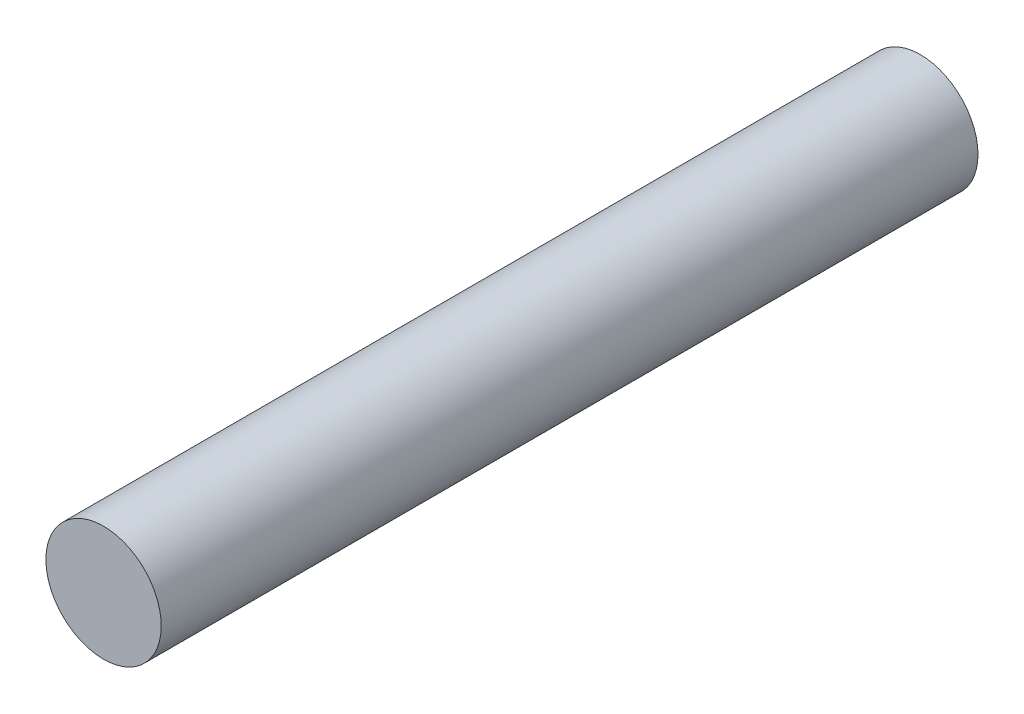
ISO-10303-21;
HEADER;
FILE_DESCRIPTION(('STEP AP214'),'2;1');
FILE_NAME('part.step','',(''),(''),'','','');
FILE_SCHEMA(('AUTOMOTIVE_DESIGN { 1 0 10303 214 1 1 1 1 }'));
ENDSEC;
DATA;
#1=APPLICATION_CONTEXT('core data for automotive mechanical design processes');
#2=APPLICATION_PROTOCOL_DEFINITION('international standard','automotive_design',2000,#1);
#3=PRODUCT_CONTEXT('',#1,'mechanical');
#4=PRODUCT('Part','Part','',(#3));
#5=PRODUCT_RELATED_PRODUCT_CATEGORY('part','',(#4));
#6=PRODUCT_DEFINITION_FORMATION('','',#4);
#7=PRODUCT_DEFINITION_CONTEXT('part definition',#1,'design');
#8=PRODUCT_DEFINITION('design','',#6,#7);
#9=PRODUCT_DEFINITION_SHAPE('','',#8);
#10=(LENGTH_UNIT() NAMED_UNIT(*) SI_UNIT(.MILLI.,.METRE.));
#11=(NAMED_UNIT(*) PLANE_ANGLE_UNIT() SI_UNIT($,.RADIAN.));
#12=(NAMED_UNIT(*) SI_UNIT($,.STERADIAN.) SOLID_ANGLE_UNIT());
#13=UNCERTAINTY_MEASURE_WITH_UNIT(LENGTH_MEASURE(1.E-05),#10,'distance_accuracy_value','');
#14=(GEOMETRIC_REPRESENTATION_CONTEXT(3) GLOBAL_UNCERTAINTY_ASSIGNED_CONTEXT((#13)) GLOBAL_UNIT_ASSIGNED_CONTEXT((#10,
#11,#12)) REPRESENTATION_CONTEXT('',''));
#15=CARTESIAN_POINT('',(0.,0.,0.));
#16=DIRECTION('',(0.,0.,1.));
#17=DIRECTION('',(1.,0.,0.));
#18=AXIS2_PLACEMENT_3D('',#15,#16,#17);
#19=CARTESIAN_POINT('',(0.,0.,85.));
#20=DIRECTION('',(0.,0.,-1.));
#21=DIRECTION('',(-1.,0.,0.));
#22=AXIS2_PLACEMENT_3D('',#19,#20,#21);
#23=CYLINDRICAL_SURFACE('',#22,6.);
#24=CARTESIAN_POINT('',(0.,0.,85.));
#25=DIRECTION('',(0.,0.,1.));
#26=DIRECTION('',(1.,0.,0.));
#27=AXIS2_PLACEMENT_3D('',#24,#25,#26);
#28=CIRCLE('',#27,6.);
#29=CARTESIAN_POINT('',(6.,0.,85.));
#30=VERTEX_POINT('',#29);
#31=EDGE_CURVE('E10',#30,#30,#28,.T.);
#32=ORIENTED_EDGE('',*,*,#31,.F.);
#33=EDGE_LOOP('',(#32));
#34=FACE_BOUND('',#33,.T.);
#35=CARTESIAN_POINT('',(0.,0.,0.));
#36=DIRECTION('',(0.,0.,1.));
#37=DIRECTION('',(1.,0.,0.));
#38=AXIS2_PLACEMENT_3D('',#35,#36,#37);
#39=CIRCLE('',#38,6.);
#40=CARTESIAN_POINT('',(6.,0.,0.));
#41=VERTEX_POINT('',#40);
#42=EDGE_CURVE('E34',#41,#41,#39,.T.);
#43=ORIENTED_EDGE('',*,*,#42,.T.);
#44=EDGE_LOOP('',(#43));
#45=FACE_BOUND('',#44,.T.);
#46=ADVANCED_FACE('F31',(#34,#45),#23,.T.);
#47=CARTESIAN_POINT('',(0.,0.,85.));
#48=DIRECTION('',(0.,0.,1.));
#49=DIRECTION('',(1.,0.,0.));
#50=AXIS2_PLACEMENT_3D('',#47,#48,#49);
#51=PLANE('',#50);
#52=ORIENTED_EDGE('',*,*,#31,.T.);
#53=EDGE_LOOP('',(#52));
#54=FACE_BOUND('',#53,.T.);
#55=ADVANCED_FACE('F46',(#54),#51,.T.);
#56=CARTESIAN_POINT('',(0.,0.,0.));
#57=DIRECTION('',(0.,0.,1.));
#58=DIRECTION('',(1.,0.,0.));
#59=AXIS2_PLACEMENT_3D('',#56,#57,#58);
#60=PLANE('',#59);
#61=ORIENTED_EDGE('',*,*,#42,.F.);
#62=EDGE_LOOP('',(#61));
#63=FACE_BOUND('',#62,.T.);
#64=ADVANCED_FACE('F44',(#63),#60,.F.);
#65=CLOSED_SHELL('',(#46,#55,#64));
#66=MANIFOLD_SOLID_BREP('B2',#65);
#67=ADVANCED_BREP_SHAPE_REPRESENTATION('',(#18,#66),#14);
#68=SHAPE_DEFINITION_REPRESENTATION(#9,#67);
ENDSEC;
END-ISO-10303-21;
